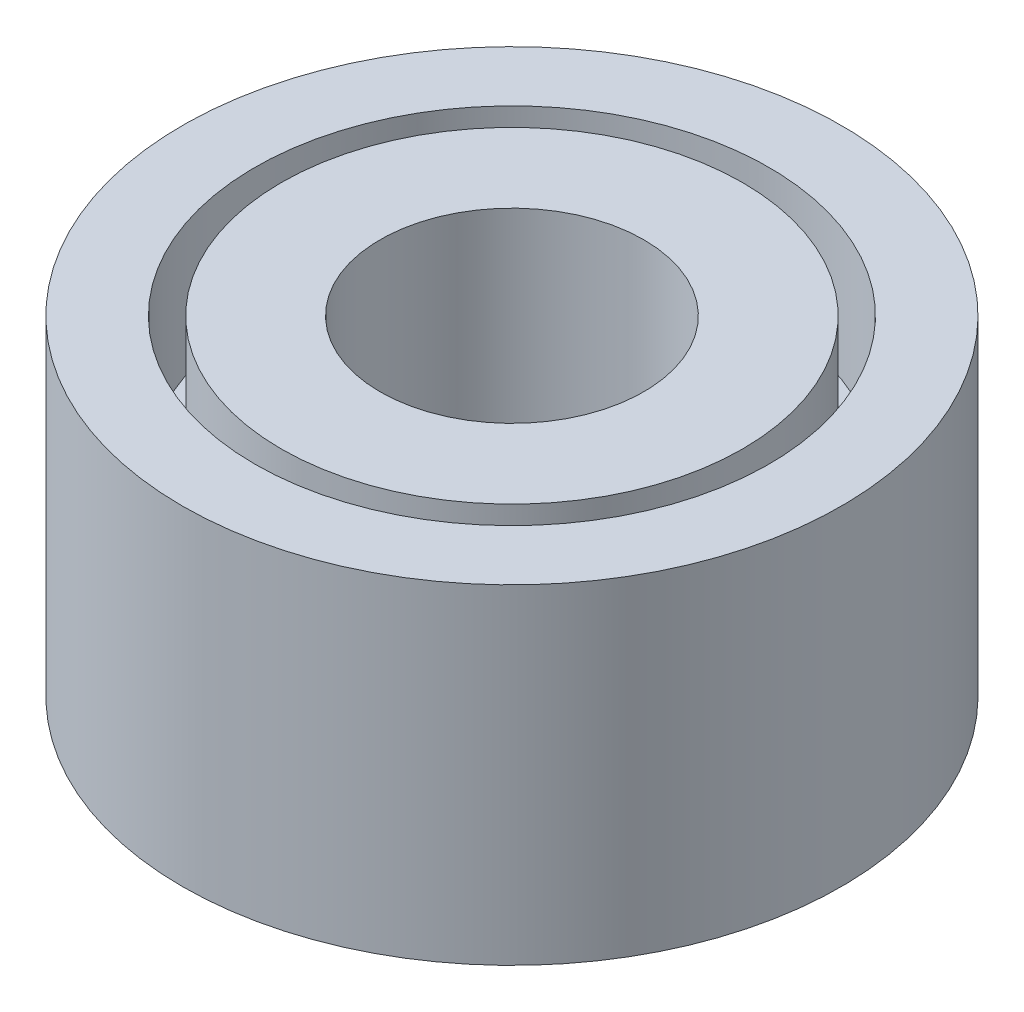
ISO-10303-21;
HEADER;
FILE_DESCRIPTION(('STEP AP214'),'2;1');
FILE_NAME('part.step','',(''),(''),'','','');
FILE_SCHEMA(('AUTOMOTIVE_DESIGN { 1 0 10303 214 1 1 1 1 }'));
ENDSEC;
DATA;
#1=APPLICATION_CONTEXT('core data for automotive mechanical design processes');
#2=APPLICATION_PROTOCOL_DEFINITION('international standard','automotive_design',2000,#1);
#3=PRODUCT_CONTEXT('',#1,'mechanical');
#4=PRODUCT('Part','Part','',(#3));
#5=PRODUCT_RELATED_PRODUCT_CATEGORY('part','',(#4));
#6=PRODUCT_DEFINITION_FORMATION('','',#4);
#7=PRODUCT_DEFINITION_CONTEXT('part definition',#1,'design');
#8=PRODUCT_DEFINITION('design','',#6,#7);
#9=PRODUCT_DEFINITION_SHAPE('','',#8);
#10=(LENGTH_UNIT() NAMED_UNIT(*) SI_UNIT(.MILLI.,.METRE.));
#11=(NAMED_UNIT(*) PLANE_ANGLE_UNIT() SI_UNIT($,.RADIAN.));
#12=(NAMED_UNIT(*) SI_UNIT($,.STERADIAN.) SOLID_ANGLE_UNIT());
#13=UNCERTAINTY_MEASURE_WITH_UNIT(LENGTH_MEASURE(1.E-05),#10,'distance_accuracy_value','');
#14=(GEOMETRIC_REPRESENTATION_CONTEXT(3) GLOBAL_UNCERTAINTY_ASSIGNED_CONTEXT((#13)) GLOBAL_UNIT_ASSIGNED_CONTEXT((#10,
#11,#12)) REPRESENTATION_CONTEXT('',''));
#15=CARTESIAN_POINT('',(0.,0.,0.));
#16=DIRECTION('',(0.,0.,1.));
#17=DIRECTION('',(1.,0.,0.));
#18=AXIS2_PLACEMENT_3D('',#15,#16,#17);
#19=CARTESIAN_POINT('',(0.,2.5,0.));
#20=DIRECTION('',(0.,1.,0.));
#21=DIRECTION('',(0.,0.,1.));
#22=AXIS2_PLACEMENT_3D('',#19,#20,#21);
#23=PLANE('',#22);
#24=CARTESIAN_POINT('',(0.,2.5,0.));
#25=DIRECTION('',(0.,1.,0.));
#26=DIRECTION('',(0.,0.,1.));
#27=AXIS2_PLACEMENT_3D('',#24,#25,#26);
#28=CIRCLE('',#27,1.);
#29=CARTESIAN_POINT('',(0.,2.5,1.));
#30=VERTEX_POINT('',#29);
#31=EDGE_CURVE('E63',#30,#30,#28,.T.);
#32=ORIENTED_EDGE('',*,*,#31,.F.);
#33=EDGE_LOOP('',(#32));
#34=FACE_BOUND('',#33,.T.);
#35=CARTESIAN_POINT('',(0.,2.5,0.));
#36=DIRECTION('',(0.,1.,0.));
#37=DIRECTION('',(0.,0.,1.));
#38=AXIS2_PLACEMENT_3D('',#35,#36,#37);
#39=CIRCLE('',#38,1.75);
#40=CARTESIAN_POINT('',(0.,2.5,1.75));
#41=VERTEX_POINT('',#40);
#42=EDGE_CURVE('E89',#41,#41,#39,.T.);
#43=ORIENTED_EDGE('',*,*,#42,.T.);
#44=EDGE_LOOP('',(#43));
#45=FACE_BOUND('',#44,.T.);
#46=ADVANCED_FACE('F52',(#34,#45),#23,.T.);
#47=CARTESIAN_POINT('',(0.,0.,0.));
#48=DIRECTION('',(0.,1.,0.));
#49=DIRECTION('',(0.,0.,1.));
#50=AXIS2_PLACEMENT_3D('',#47,#48,#49);
#51=PLANE('',#50);
#52=CARTESIAN_POINT('',(0.,0.,0.));
#53=DIRECTION('',(0.,1.,0.));
#54=DIRECTION('',(0.,0.,1.));
#55=AXIS2_PLACEMENT_3D('',#52,#53,#54);
#56=CIRCLE('',#55,1.);
#57=CARTESIAN_POINT('',(0.,0.,1.));
#58=VERTEX_POINT('',#57);
#59=EDGE_CURVE('E65',#58,#58,#56,.T.);
#60=ORIENTED_EDGE('',*,*,#59,.T.);
#61=EDGE_LOOP('',(#60));
#62=FACE_BOUND('',#61,.T.);
#63=CARTESIAN_POINT('',(0.,0.,0.));
#64=DIRECTION('',(0.,1.,0.));
#65=DIRECTION('',(0.,0.,1.));
#66=AXIS2_PLACEMENT_3D('',#63,#64,#65);
#67=CIRCLE('',#66,1.75);
#68=CARTESIAN_POINT('',(0.,0.,1.75));
#69=VERTEX_POINT('',#68);
#70=EDGE_CURVE('E77',#69,#69,#67,.T.);
#71=ORIENTED_EDGE('',*,*,#70,.F.);
#72=EDGE_LOOP('',(#71));
#73=FACE_BOUND('',#72,.T.);
#74=ADVANCED_FACE('F114',(#62,#73),#51,.F.);
#75=CARTESIAN_POINT('',(0.,2.5,0.));
#76=DIRECTION('',(0.,1.,0.));
#77=DIRECTION('',(0.,0.,1.));
#78=AXIS2_PLACEMENT_3D('',#75,#76,#77);
#79=CIRCLE('',#78,1.95);
#80=CARTESIAN_POINT('',(0.,2.5,1.95));
#81=VERTEX_POINT('',#80);
#82=EDGE_CURVE('E83',#81,#81,#79,.T.);
#83=ORIENTED_EDGE('',*,*,#82,.F.);
#84=EDGE_LOOP('',(#83));
#85=FACE_BOUND('',#84,.T.);
#86=CARTESIAN_POINT('',(0.,2.5,0.));
#87=DIRECTION('',(0.,1.,0.));
#88=DIRECTION('',(0.,0.,1.));
#89=AXIS2_PLACEMENT_3D('',#86,#87,#88);
#90=CIRCLE('',#89,2.5);
#91=CARTESIAN_POINT('',(0.,2.5,2.5));
#92=VERTEX_POINT('',#91);
#93=EDGE_CURVE('E11',#92,#92,#90,.T.);
#94=ORIENTED_EDGE('',*,*,#93,.T.);
#95=EDGE_LOOP('',(#94));
#96=FACE_BOUND('',#95,.T.);
#97=ADVANCED_FACE('F111',(#85,#96),#23,.T.);
#98=CARTESIAN_POINT('',(0.,0.,0.));
#99=DIRECTION('',(0.,1.,0.));
#100=DIRECTION('',(1.,0.,0.));
#101=AXIS2_PLACEMENT_3D('',#98,#99,#100);
#102=CIRCLE('',#101,1.95);
#103=CARTESIAN_POINT('',(1.95,0.,0.));
#104=VERTEX_POINT('',#103);
#105=EDGE_CURVE('E71',#104,#104,#102,.T.);
#106=ORIENTED_EDGE('',*,*,#105,.T.);
#107=EDGE_LOOP('',(#106));
#108=FACE_BOUND('',#107,.T.);
#109=CARTESIAN_POINT('',(0.,0.,0.));
#110=DIRECTION('',(0.,1.,0.));
#111=DIRECTION('',(0.,0.,1.));
#112=AXIS2_PLACEMENT_3D('',#109,#110,#111);
#113=CIRCLE('',#112,2.5);
#114=CARTESIAN_POINT('',(0.,0.,2.5));
#115=VERTEX_POINT('',#114);
#116=EDGE_CURVE('E56',#115,#115,#113,.T.);
#117=ORIENTED_EDGE('',*,*,#116,.F.);
#118=EDGE_LOOP('',(#117));
#119=FACE_BOUND('',#118,.T.);
#120=ADVANCED_FACE('F113',(#108,#119),#51,.F.);
#121=CARTESIAN_POINT('',(0.,2.5,0.));
#122=DIRECTION('',(0.,-1.,0.));
#123=DIRECTION('',(0.,0.,-1.));
#124=AXIS2_PLACEMENT_3D('',#121,#122,#123);
#125=CYLINDRICAL_SURFACE('',#124,2.5);
#126=ORIENTED_EDGE('',*,*,#93,.F.);
#127=EDGE_LOOP('',(#126));
#128=FACE_BOUND('',#127,.T.);
#129=ORIENTED_EDGE('',*,*,#116,.T.);
#130=EDGE_LOOP('',(#129));
#131=FACE_BOUND('',#130,.T.);
#132=ADVANCED_FACE('F54',(#128,#131),#125,.T.);
#133=CARTESIAN_POINT('',(0.,2.5,0.));
#134=DIRECTION('',(0.,-1.,0.));
#135=DIRECTION('',(0.,0.,-1.));
#136=AXIS2_PLACEMENT_3D('',#133,#134,#135);
#137=CYLINDRICAL_SURFACE('',#136,1.);
#138=ORIENTED_EDGE('',*,*,#31,.T.);
#139=EDGE_LOOP('',(#138));
#140=FACE_BOUND('',#139,.T.);
#141=ORIENTED_EDGE('',*,*,#59,.F.);
#142=EDGE_LOOP('',(#141));
#143=FACE_BOUND('',#142,.T.);
#144=ADVANCED_FACE('F142',(#140,#143),#137,.F.);
#145=CARTESIAN_POINT('',(0.,1.,0.));
#146=DIRECTION('',(0.,1.,0.));
#147=DIRECTION('',(0.,0.,1.));
#148=AXIS2_PLACEMENT_3D('',#145,#146,#147);
#149=PLANE('',#148);
#150=CARTESIAN_POINT('',(0.,1.,0.));
#151=DIRECTION('',(0.,1.,0.));
#152=DIRECTION('',(1.,0.,0.));
#153=AXIS2_PLACEMENT_3D('',#150,#151,#152);
#154=CIRCLE('',#153,1.95);
#155=CARTESIAN_POINT('',(1.95,1.,0.));
#156=VERTEX_POINT('',#155);
#157=EDGE_CURVE('E68',#156,#156,#154,.T.);
#158=ORIENTED_EDGE('',*,*,#157,.F.);
#159=EDGE_LOOP('',(#158));
#160=FACE_BOUND('',#159,.T.);
#161=CARTESIAN_POINT('',(0.,1.,0.));
#162=DIRECTION('',(0.,1.,0.));
#163=DIRECTION('',(0.,0.,1.));
#164=AXIS2_PLACEMENT_3D('',#161,#162,#163);
#165=CIRCLE('',#164,1.75);
#166=CARTESIAN_POINT('',(0.,1.,1.75));
#167=VERTEX_POINT('',#166);
#168=EDGE_CURVE('E74',#167,#167,#165,.T.);
#169=ORIENTED_EDGE('',*,*,#168,.T.);
#170=EDGE_LOOP('',(#169));
#171=FACE_BOUND('',#170,.T.);
#172=ADVANCED_FACE('F139',(#160,#171),#149,.F.);
#173=CARTESIAN_POINT('',(0.,1.,0.));
#174=DIRECTION('',(0.,-1.,0.));
#175=DIRECTION('',(0.,0.,-1.));
#176=AXIS2_PLACEMENT_3D('',#173,#174,#175);
#177=CYLINDRICAL_SURFACE('',#176,1.95);
#178=ORIENTED_EDGE('',*,*,#157,.T.);
#179=EDGE_LOOP('',(#178));
#180=FACE_BOUND('',#179,.T.);
#181=ORIENTED_EDGE('',*,*,#105,.F.);
#182=EDGE_LOOP('',(#181));
#183=FACE_BOUND('',#182,.T.);
#184=ADVANCED_FACE('F137',(#180,#183),#177,.F.);
#185=CARTESIAN_POINT('',(0.,1.,0.));
#186=DIRECTION('',(0.,-1.,0.));
#187=DIRECTION('',(0.,0.,-1.));
#188=AXIS2_PLACEMENT_3D('',#185,#186,#187);
#189=CYLINDRICAL_SURFACE('',#188,1.75);
#190=ORIENTED_EDGE('',*,*,#168,.F.);
#191=EDGE_LOOP('',(#190));
#192=FACE_BOUND('',#191,.T.);
#193=ORIENTED_EDGE('',*,*,#70,.T.);
#194=EDGE_LOOP('',(#193));
#195=FACE_BOUND('',#194,.T.);
#196=ADVANCED_FACE('F107',(#192,#195),#189,.T.);
#197=CARTESIAN_POINT('',(0.,1.5,0.));
#198=DIRECTION('',(0.,1.,0.));
#199=DIRECTION('',(0.,0.,1.));
#200=AXIS2_PLACEMENT_3D('',#197,#198,#199);
#201=CYLINDRICAL_SURFACE('',#200,1.95);
#202=CARTESIAN_POINT('',(0.,1.5,0.));
#203=DIRECTION('',(0.,1.,0.));
#204=DIRECTION('',(0.,0.,1.));
#205=AXIS2_PLACEMENT_3D('',#202,#203,#204);
#206=CIRCLE('',#205,1.95);
#207=CARTESIAN_POINT('',(0.,1.5,1.95));
#208=VERTEX_POINT('',#207);
#209=EDGE_CURVE('E80',#208,#208,#206,.T.);
#210=ORIENTED_EDGE('',*,*,#209,.F.);
#211=EDGE_LOOP('',(#210));
#212=FACE_BOUND('',#211,.T.);
#213=ORIENTED_EDGE('',*,*,#82,.T.);
#214=EDGE_LOOP('',(#213));
#215=FACE_BOUND('',#214,.T.);
#216=ADVANCED_FACE('F101',(#212,#215),#201,.F.);
#217=CARTESIAN_POINT('',(0.,1.5,0.));
#218=DIRECTION('',(0.,1.,0.));
#219=DIRECTION('',(0.,0.,1.));
#220=AXIS2_PLACEMENT_3D('',#217,#218,#219);
#221=PLANE('',#220);
#222=CARTESIAN_POINT('',(0.,1.5,0.));
#223=DIRECTION('',(0.,1.,0.));
#224=DIRECTION('',(0.,0.,1.));
#225=AXIS2_PLACEMENT_3D('',#222,#223,#224);
#226=CIRCLE('',#225,1.75);
#227=CARTESIAN_POINT('',(0.,1.5,1.75));
#228=VERTEX_POINT('',#227);
#229=EDGE_CURVE('E86',#228,#228,#226,.T.);
#230=ORIENTED_EDGE('',*,*,#229,.F.);
#231=EDGE_LOOP('',(#230));
#232=FACE_BOUND('',#231,.T.);
#233=ORIENTED_EDGE('',*,*,#209,.T.);
#234=EDGE_LOOP('',(#233));
#235=FACE_BOUND('',#234,.T.);
#236=ADVANCED_FACE('F98',(#232,#235),#221,.T.);
#237=CARTESIAN_POINT('',(0.,1.5,0.));
#238=DIRECTION('',(0.,1.,0.));
#239=DIRECTION('',(0.,0.,1.));
#240=AXIS2_PLACEMENT_3D('',#237,#238,#239);
#241=CYLINDRICAL_SURFACE('',#240,1.75);
#242=ORIENTED_EDGE('',*,*,#229,.T.);
#243=EDGE_LOOP('',(#242));
#244=FACE_BOUND('',#243,.T.);
#245=ORIENTED_EDGE('',*,*,#42,.F.);
#246=EDGE_LOOP('',(#245));
#247=FACE_BOUND('',#246,.T.);
#248=ADVANCED_FACE('F95',(#244,#247),#241,.T.);
#249=CLOSED_SHELL('',(#46,#74,#97,#120,#132,#144,#172,#184,#196,#216,#236,#248));
#250=MANIFOLD_SOLID_BREP('B2',#249);
#251=ADVANCED_BREP_SHAPE_REPRESENTATION('',(#18,#250),#14);
#252=SHAPE_DEFINITION_REPRESENTATION(#9,#251);
ENDSEC;
END-ISO-10303-21;
